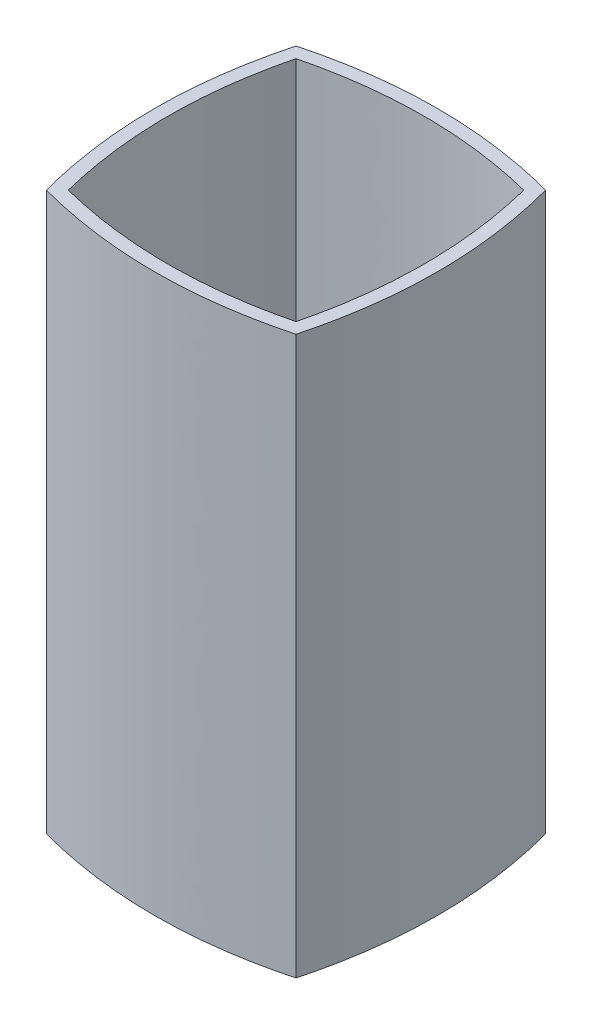
ISO-10303-21;
HEADER;
FILE_DESCRIPTION(('STEP AP214'),'2;1');
FILE_NAME('part.step','',(''),(''),'','','');
FILE_SCHEMA(('AUTOMOTIVE_DESIGN { 1 0 10303 214 1 1 1 1 }'));
ENDSEC;
DATA;
#1=APPLICATION_CONTEXT('core data for automotive mechanical design processes');
#2=APPLICATION_PROTOCOL_DEFINITION('international standard','automotive_design',2000,#1);
#3=PRODUCT_CONTEXT('',#1,'mechanical');
#4=PRODUCT('Part','Part','',(#3));
#5=PRODUCT_RELATED_PRODUCT_CATEGORY('part','',(#4));
#6=PRODUCT_DEFINITION_FORMATION('','',#4);
#7=PRODUCT_DEFINITION_CONTEXT('part definition',#1,'design');
#8=PRODUCT_DEFINITION('design','',#6,#7);
#9=PRODUCT_DEFINITION_SHAPE('','',#8);
#10=(LENGTH_UNIT() NAMED_UNIT(*) SI_UNIT(.MILLI.,.METRE.));
#11=(NAMED_UNIT(*) PLANE_ANGLE_UNIT() SI_UNIT($,.RADIAN.));
#12=(NAMED_UNIT(*) SI_UNIT($,.STERADIAN.) SOLID_ANGLE_UNIT());
#13=UNCERTAINTY_MEASURE_WITH_UNIT(LENGTH_MEASURE(1.E-05),#10,'distance_accuracy_value','');
#14=(GEOMETRIC_REPRESENTATION_CONTEXT(3) GLOBAL_UNCERTAINTY_ASSIGNED_CONTEXT((#13)) GLOBAL_UNIT_ASSIGNED_CONTEXT((#10,
#11,#12)) REPRESENTATION_CONTEXT('',''));
#15=CARTESIAN_POINT('',(0.,0.,0.));
#16=DIRECTION('',(0.,0.,1.));
#17=DIRECTION('',(1.,0.,0.));
#18=AXIS2_PLACEMENT_3D('',#15,#16,#17);
#19=CARTESIAN_POINT('',(-26.9875,106.3625,0.));
#20=DIRECTION('',(0.,-1.,0.));
#21=DIRECTION('',(0.,0.,-1.));
#22=AXIS2_PLACEMENT_3D('',#19,#20,#21);
#23=PLANE('',#22);
#24=CARTESIAN_POINT('',(-23.8125,106.3625,-23.8125));
#25=CARTESIAN_POINT('',(-30.1625,106.3625,0.));
#26=CARTESIAN_POINT('',(-23.8125,106.3625,23.8125));
#27=B_SPLINE_CURVE_WITH_KNOTS('',2,(#24,#25,#26),.UNSPECIFIED.,.F.,.F.,(3,3),(0.,1.),.UNSPECIFIED.);
#28=CARTESIAN_POINT('',(-23.8125,106.3625,-23.8125));
#29=VERTEX_POINT('',#28);
#30=CARTESIAN_POINT('',(-23.8125,106.3625,23.8125));
#31=VERTEX_POINT('',#30);
#32=EDGE_CURVE('E265',#29,#31,#27,.T.);
#33=ORIENTED_EDGE('',*,*,#32,.T.);
#34=CARTESIAN_POINT('',(-23.8125,106.3625,23.8125));
#35=CARTESIAN_POINT('',(0.,106.3625,30.1625));
#36=CARTESIAN_POINT('',(23.8125,106.3625,23.8125));
#37=B_SPLINE_CURVE_WITH_KNOTS('',2,(#34,#35,#36),.UNSPECIFIED.,.F.,.F.,(3,3),(0.,1.),.UNSPECIFIED.);
#38=CARTESIAN_POINT('',(23.8125,106.3625,23.8125));
#39=VERTEX_POINT('',#38);
#40=EDGE_CURVE('E285',#31,#39,#37,.T.);
#41=ORIENTED_EDGE('',*,*,#40,.T.);
#42=CARTESIAN_POINT('',(23.8125,106.3625,-23.8125));
#43=CARTESIAN_POINT('',(30.1625,106.3625,0.));
#44=CARTESIAN_POINT('',(23.8125,106.3625,23.8125));
#45=B_SPLINE_CURVE_WITH_KNOTS('',2,(#42,#43,#44),.UNSPECIFIED.,.F.,.F.,(3,3),(0.,1.),.UNSPECIFIED.);
#46=CARTESIAN_POINT('',(23.8125,106.3625,-23.8125));
#47=VERTEX_POINT('',#46);
#48=EDGE_CURVE('E229',#47,#39,#45,.T.);
#49=ORIENTED_EDGE('',*,*,#48,.F.);
#50=CARTESIAN_POINT('',(-23.8125,106.3625,-23.8125));
#51=CARTESIAN_POINT('',(0.,106.3625,-30.1625));
#52=CARTESIAN_POINT('',(23.8125,106.3625,-23.8125));
#53=B_SPLINE_CURVE_WITH_KNOTS('',2,(#50,#51,#52),.UNSPECIFIED.,.F.,.F.,(3,3),(0.,1.),.UNSPECIFIED.);
#54=EDGE_CURVE('E222',#29,#47,#53,.T.);
#55=ORIENTED_EDGE('',*,*,#54,.F.);
#56=EDGE_LOOP('',(#33,#41,#49,#55));
#57=FACE_BOUND('',#56,.T.);
#58=CARTESIAN_POINT('',(-21.7278824316532,106.3625,-21.7278824316532));
#59=CARTESIAN_POINT('',(-22.6181644407082,106.3625,-18.1699784596124));
#60=CARTESIAN_POINT('',(-23.2995731862004,106.3625,-14.5748367331748));
#61=CARTESIAN_POINT('',(-23.9869531116533,106.3625,-9.12244818399765));
#62=CARTESIAN_POINT('',(-24.1600079505111,106.3625,-7.29530286620825));
#63=CARTESIAN_POINT('',(-24.390253271937,106.3625,-3.64258122880582));
#64=CARTESIAN_POINT('',(-24.44783328894,106.3625,-1.81431538247749));
#65=CARTESIAN_POINT('',(-24.4471638088413,106.3625,1.84605100407184));
#66=CARTESIAN_POINT('',(-24.3886108908414,106.3625,3.68152659891922));
#67=CARTESIAN_POINT('',(-24.1567139061339,106.3625,7.3343929685884));
#68=CARTESIAN_POINT('',(-23.9836306928442,106.3625,9.15253036494701));
#69=CARTESIAN_POINT('',(-23.2976290557148,106.3625,14.5827306689455));
#70=CARTESIAN_POINT('',(-22.6180115727221,106.3625,18.1705893779611));
#71=CARTESIAN_POINT('',(-21.7278824316532,106.3625,21.7278824316532));
#72=B_SPLINE_CURVE_WITH_KNOTS('',3,(#58,#59,#60,#61,#62,#63,#64,#65,#66,#67,#68,#69,#70,#71),
.UNSPECIFIED.,.F.,.F.,(4,2,2,2,2,2,4),(0.,0.25,0.375,0.5,0.625,0.75,1.),.UNSPECIFIED.);
#73=CARTESIAN_POINT('',(-21.7278824316532,106.3625,-21.7278824316532));
#74=VERTEX_POINT('',#73);
#75=CARTESIAN_POINT('',(-21.7278824316532,106.3625,21.7278824316532));
#76=VERTEX_POINT('',#75);
#77=EDGE_CURVE('E165',#74,#76,#72,.T.);
#78=ORIENTED_EDGE('',*,*,#77,.F.);
#79=CARTESIAN_POINT('',(-21.7278824316532,106.3625,-21.7278824316532));
#80=CARTESIAN_POINT('',(-18.1699784596123,106.3625,-22.6181644407082));
#81=CARTESIAN_POINT('',(-14.5748367331748,106.3625,-23.2995731862004));
#82=CARTESIAN_POINT('',(-9.12244818399765,106.3625,-23.9869531116533));
#83=CARTESIAN_POINT('',(-7.29530286620824,106.3625,-24.1600079505111));
#84=CARTESIAN_POINT('',(-3.64258122880581,106.3625,-24.390253271937));
#85=CARTESIAN_POINT('',(-1.81431538247748,106.3625,-24.44783328894));
#86=CARTESIAN_POINT('',(1.84605100407185,106.3625,-24.4471638088413));
#87=CARTESIAN_POINT('',(3.68152659891923,106.3625,-24.3886108908414));
#88=CARTESIAN_POINT('',(7.33439296858842,106.3625,-24.1567139061339));
#89=CARTESIAN_POINT('',(9.152530364947,106.3625,-23.9836306928442));
#90=CARTESIAN_POINT('',(14.5827306689455,106.3625,-23.2976290557148));
#91=CARTESIAN_POINT('',(18.1705893779611,106.3625,-22.6180115727221));
#92=CARTESIAN_POINT('',(21.7278824316532,106.3625,-21.7278824316532));
#93=B_SPLINE_CURVE_WITH_KNOTS('',3,(#79,#80,#81,#82,#83,#84,#85,#86,#87,#88,#89,#90,#91,#92),
.UNSPECIFIED.,.F.,.F.,(4,2,2,2,2,2,4),(0.,0.25,0.375,0.5,0.625,0.75,1.),.UNSPECIFIED.);
#94=CARTESIAN_POINT('',(21.7278824316532,106.3625,-21.7278824316532));
#95=VERTEX_POINT('',#94);
#96=EDGE_CURVE('E185',#74,#95,#93,.T.);
#97=ORIENTED_EDGE('',*,*,#96,.T.);
#98=CARTESIAN_POINT('',(21.7278824316532,106.3625,-21.7278824316532));
#99=CARTESIAN_POINT('',(22.6181644407082,106.3625,-18.1699784596124));
#100=CARTESIAN_POINT('',(23.2995731862004,106.3625,-14.5748367331748));
#101=CARTESIAN_POINT('',(23.9869531116533,106.3625,-9.12244818399765));
#102=CARTESIAN_POINT('',(24.1600079505111,106.3625,-7.29530286620825));
#103=CARTESIAN_POINT('',(24.390253271937,106.3625,-3.64258122880581));
#104=CARTESIAN_POINT('',(24.44783328894,106.3625,-1.81431538247749));
#105=CARTESIAN_POINT('',(24.4471638088413,106.3625,1.84605100407184));
#106=CARTESIAN_POINT('',(24.3886108908414,106.3625,3.68152659891922));
#107=CARTESIAN_POINT('',(24.1567139061339,106.3625,7.33439296858841));
#108=CARTESIAN_POINT('',(23.9836306928442,106.3625,9.15253036494701));
#109=CARTESIAN_POINT('',(23.2976290557148,106.3625,14.5827306689455));
#110=CARTESIAN_POINT('',(22.6180115727222,106.3625,18.1705893779611));
#111=CARTESIAN_POINT('',(21.7278824316532,106.3625,21.7278824316532));
#112=B_SPLINE_CURVE_WITH_KNOTS('',3,(#98,#99,#100,#101,#102,#103,#104,#105,#106,#107,#108,#109,
#110,#111),.UNSPECIFIED.,.F.,.F.,(4,2,2,2,2,2,4),(0.,0.25,0.375,0.5,0.625,0.75,1.),.UNSPECIFIED.);
#113=CARTESIAN_POINT('',(21.7278824316532,106.3625,21.7278824316532));
#114=VERTEX_POINT('',#113);
#115=EDGE_CURVE('E115',#95,#114,#112,.T.);
#116=ORIENTED_EDGE('',*,*,#115,.T.);
#117=CARTESIAN_POINT('',(-21.7278824316532,106.3625,21.7278824316532));
#118=CARTESIAN_POINT('',(-18.1699784596124,106.3625,22.6181644407082));
#119=CARTESIAN_POINT('',(-14.5748367331748,106.3625,23.2995731862004));
#120=CARTESIAN_POINT('',(-9.12244818399764,106.3625,23.9869531116533));
#121=CARTESIAN_POINT('',(-7.29530286620825,106.3625,24.1600079505111));
#122=CARTESIAN_POINT('',(-3.64258122880581,106.3625,24.390253271937));
#123=CARTESIAN_POINT('',(-1.81431538247748,106.3625,24.44783328894));
#124=CARTESIAN_POINT('',(1.84605100407186,106.3625,24.4471638088413));
#125=CARTESIAN_POINT('',(3.68152659891924,106.3625,24.3886108908414));
#126=CARTESIAN_POINT('',(7.33439296858843,106.3625,24.1567139061339));
#127=CARTESIAN_POINT('',(9.15253036494701,106.3625,23.9836306928442));
#128=CARTESIAN_POINT('',(14.5827306689455,106.3625,23.2976290557148));
#129=CARTESIAN_POINT('',(18.1705893779611,106.3625,22.6180115727221));
#130=CARTESIAN_POINT('',(21.7278824316532,106.3625,21.7278824316532));
#131=B_SPLINE_CURVE_WITH_KNOTS('',3,(#117,#118,#119,#120,#121,#122,#123,#124,#125,#126,#127,
#128,#129,#130),.UNSPECIFIED.,.F.,.F.,(4,2,2,2,2,2,4),(0.,0.25,0.375,0.5,0.625,0.75,1.),.UNSPECIFIED.);
#132=EDGE_CURVE('E174',#76,#114,#131,.T.);
#133=ORIENTED_EDGE('',*,*,#132,.F.);
#134=EDGE_LOOP('',(#78,#97,#116,#133));
#135=FACE_BOUND('',#134,.T.);
#136=ADVANCED_FACE('F99',(#57,#135),#23,.F.);
#137=CARTESIAN_POINT('',(-26.9875,0.,0.));
#138=DIRECTION('',(0.,-1.,0.));
#139=DIRECTION('',(0.,0.,-1.));
#140=AXIS2_PLACEMENT_3D('',#137,#138,#139);
#141=PLANE('',#140);
#142=CARTESIAN_POINT('',(-23.8125,0.,-23.8125));
#143=CARTESIAN_POINT('',(-30.1625,0.,0.));
#144=CARTESIAN_POINT('',(-23.8125,0.,23.8125));
#145=B_SPLINE_CURVE_WITH_KNOTS('',2,(#142,#143,#144),.UNSPECIFIED.,.F.,.F.,(3,3),(0.,1.),.UNSPECIFIED.);
#146=CARTESIAN_POINT('',(-23.8125,0.,-23.8125));
#147=VERTEX_POINT('',#146);
#148=CARTESIAN_POINT('',(-23.8125,0.,23.8125));
#149=VERTEX_POINT('',#148);
#150=EDGE_CURVE('E181',#147,#149,#145,.T.);
#151=ORIENTED_EDGE('',*,*,#150,.F.);
#152=CARTESIAN_POINT('',(-23.8125,0.,-23.8125));
#153=CARTESIAN_POINT('',(0.,0.,-30.1625));
#154=CARTESIAN_POINT('',(23.8125,0.,-23.8125));
#155=B_SPLINE_CURVE_WITH_KNOTS('',2,(#152,#153,#154),.UNSPECIFIED.,.F.,.F.,(3,3),(0.,1.),.UNSPECIFIED.);
#156=CARTESIAN_POINT('',(23.8125,0.,-23.8125));
#157=VERTEX_POINT('',#156);
#158=EDGE_CURVE('E257',#147,#157,#155,.T.);
#159=ORIENTED_EDGE('',*,*,#158,.T.);
#160=CARTESIAN_POINT('',(23.8125,0.,-23.8125));
#161=CARTESIAN_POINT('',(30.1625,0.,0.));
#162=CARTESIAN_POINT('',(23.8125,0.,23.8125));
#163=B_SPLINE_CURVE_WITH_KNOTS('',2,(#160,#161,#162),.UNSPECIFIED.,.F.,.F.,(3,3),(0.,1.),.UNSPECIFIED.);
#164=CARTESIAN_POINT('',(23.8125,0.,23.8125));
#165=VERTEX_POINT('',#164);
#166=EDGE_CURVE('E249',#157,#165,#163,.T.);
#167=ORIENTED_EDGE('',*,*,#166,.T.);
#168=CARTESIAN_POINT('',(-23.8125,0.,23.8125));
#169=CARTESIAN_POINT('',(0.,0.,30.1625));
#170=CARTESIAN_POINT('',(23.8125,0.,23.8125));
#171=B_SPLINE_CURVE_WITH_KNOTS('',2,(#168,#169,#170),.UNSPECIFIED.,.F.,.F.,(3,3),(0.,1.),.UNSPECIFIED.);
#172=EDGE_CURVE('E241',#149,#165,#171,.T.);
#173=ORIENTED_EDGE('',*,*,#172,.F.);
#174=EDGE_LOOP('',(#151,#159,#167,#173));
#175=FACE_BOUND('',#174,.T.);
#176=CARTESIAN_POINT('',(-21.7278824316532,0.,-21.7278824316532));
#177=CARTESIAN_POINT('',(-18.1699784596123,0.,-22.6181644407082));
#178=CARTESIAN_POINT('',(-14.5748367331748,0.,-23.2995731862004));
#179=CARTESIAN_POINT('',(-9.12244818399765,0.,-23.9869531116533));
#180=CARTESIAN_POINT('',(-7.29530286620824,0.,-24.1600079505111));
#181=CARTESIAN_POINT('',(-3.64258122880581,0.,-24.390253271937));
#182=CARTESIAN_POINT('',(-1.81431538247748,0.,-24.44783328894));
#183=CARTESIAN_POINT('',(1.84605100407185,0.,-24.4471638088413));
#184=CARTESIAN_POINT('',(3.68152659891923,0.,-24.3886108908414));
#185=CARTESIAN_POINT('',(7.33439296858842,0.,-24.1567139061339));
#186=CARTESIAN_POINT('',(9.152530364947,0.,-23.9836306928442));
#187=CARTESIAN_POINT('',(14.5827306689455,0.,-23.2976290557148));
#188=CARTESIAN_POINT('',(18.1705893779611,0.,-22.6180115727221));
#189=CARTESIAN_POINT('',(21.7278824316532,0.,-21.7278824316532));
#190=B_SPLINE_CURVE_WITH_KNOTS('',3,(#176,#177,#178,#179,#180,#181,#182,#183,#184,#185,#186,
#187,#188,#189),.UNSPECIFIED.,.F.,.F.,(4,2,2,2,2,2,4),(0.,0.25,0.375,0.5,0.625,0.75,1.),.UNSPECIFIED.);
#191=CARTESIAN_POINT('',(-21.7278824316532,0.,-21.7278824316532));
#192=VERTEX_POINT('',#191);
#193=CARTESIAN_POINT('',(21.7278824316532,0.,-21.7278824316532));
#194=VERTEX_POINT('',#193);
#195=EDGE_CURVE('E175',#192,#194,#190,.T.);
#196=ORIENTED_EDGE('',*,*,#195,.F.);
#197=CARTESIAN_POINT('',(-21.7278824316532,0.,-21.7278824316532));
#198=CARTESIAN_POINT('',(-22.6181644407082,0.,-18.1699784596124));
#199=CARTESIAN_POINT('',(-23.2995731862004,0.,-14.5748367331748));
#200=CARTESIAN_POINT('',(-23.9869531116533,0.,-9.12244818399765));
#201=CARTESIAN_POINT('',(-24.1600079505111,0.,-7.29530286620825));
#202=CARTESIAN_POINT('',(-24.390253271937,0.,-3.64258122880582));
#203=CARTESIAN_POINT('',(-24.44783328894,0.,-1.81431538247749));
#204=CARTESIAN_POINT('',(-24.4471638088413,0.,1.84605100407184));
#205=CARTESIAN_POINT('',(-24.3886108908414,0.,3.68152659891922));
#206=CARTESIAN_POINT('',(-24.1567139061339,0.,7.3343929685884));
#207=CARTESIAN_POINT('',(-23.9836306928442,0.,9.15253036494701));
#208=CARTESIAN_POINT('',(-23.2976290557148,0.,14.5827306689455));
#209=CARTESIAN_POINT('',(-22.6180115727221,0.,18.1705893779611));
#210=CARTESIAN_POINT('',(-21.7278824316532,0.,21.7278824316532));
#211=B_SPLINE_CURVE_WITH_KNOTS('',3,(#197,#198,#199,#200,#201,#202,#203,#204,#205,#206,#207,
#208,#209,#210),.UNSPECIFIED.,.F.,.F.,(4,2,2,2,2,2,4),(0.,0.25,0.375,0.5,0.625,0.75,1.),.UNSPECIFIED.);
#212=CARTESIAN_POINT('',(-21.7278824316532,0.,21.7278824316532));
#213=VERTEX_POINT('',#212);
#214=EDGE_CURVE('E123',#192,#213,#211,.T.);
#215=ORIENTED_EDGE('',*,*,#214,.T.);
#216=CARTESIAN_POINT('',(-21.7278824316532,0.,21.7278824316532));
#217=CARTESIAN_POINT('',(-18.1699784596124,0.,22.6181644407082));
#218=CARTESIAN_POINT('',(-14.5748367331748,0.,23.2995731862004));
#219=CARTESIAN_POINT('',(-9.12244818399764,0.,23.9869531116533));
#220=CARTESIAN_POINT('',(-7.29530286620825,0.,24.1600079505111));
#221=CARTESIAN_POINT('',(-3.64258122880581,0.,24.390253271937));
#222=CARTESIAN_POINT('',(-1.81431538247748,0.,24.44783328894));
#223=CARTESIAN_POINT('',(1.84605100407186,0.,24.4471638088413));
#224=CARTESIAN_POINT('',(3.68152659891924,0.,24.3886108908414));
#225=CARTESIAN_POINT('',(7.33439296858843,0.,24.1567139061339));
#226=CARTESIAN_POINT('',(9.15253036494701,0.,23.9836306928442));
#227=CARTESIAN_POINT('',(14.5827306689455,0.,23.2976290557148));
#228=CARTESIAN_POINT('',(18.1705893779611,0.,22.6180115727221));
#229=CARTESIAN_POINT('',(21.7278824316532,0.,21.7278824316532));
#230=B_SPLINE_CURVE_WITH_KNOTS('',3,(#216,#217,#218,#219,#220,#221,#222,#223,#224,#225,#226,
#227,#228,#229),.UNSPECIFIED.,.F.,.F.,(4,2,2,2,2,2,4),(0.,0.25,0.375,0.5,0.625,0.75,1.),.UNSPECIFIED.);
#231=CARTESIAN_POINT('',(21.7278824316532,0.,21.7278824316532));
#232=VERTEX_POINT('',#231);
#233=EDGE_CURVE('E180',#213,#232,#230,.T.);
#234=ORIENTED_EDGE('',*,*,#233,.T.);
#235=CARTESIAN_POINT('',(21.7278824316532,0.,-21.7278824316532));
#236=CARTESIAN_POINT('',(22.6181644407082,0.,-18.1699784596124));
#237=CARTESIAN_POINT('',(23.2995731862004,0.,-14.5748367331748));
#238=CARTESIAN_POINT('',(23.9869531116533,0.,-9.12244818399765));
#239=CARTESIAN_POINT('',(24.1600079505111,0.,-7.29530286620825));
#240=CARTESIAN_POINT('',(24.390253271937,0.,-3.64258122880581));
#241=CARTESIAN_POINT('',(24.44783328894,0.,-1.81431538247749));
#242=CARTESIAN_POINT('',(24.4471638088413,0.,1.84605100407184));
#243=CARTESIAN_POINT('',(24.3886108908414,0.,3.68152659891922));
#244=CARTESIAN_POINT('',(24.1567139061339,0.,7.33439296858841));
#245=CARTESIAN_POINT('',(23.9836306928442,0.,9.15253036494701));
#246=CARTESIAN_POINT('',(23.2976290557148,0.,14.5827306689455));
#247=CARTESIAN_POINT('',(22.6180115727222,0.,18.1705893779611));
#248=CARTESIAN_POINT('',(21.7278824316532,0.,21.7278824316532));
#249=B_SPLINE_CURVE_WITH_KNOTS('',3,(#235,#236,#237,#238,#239,#240,#241,#242,#243,#244,#245,
#246,#247,#248),.UNSPECIFIED.,.F.,.F.,(4,2,2,2,2,2,4),(0.,0.25,0.375,0.5,0.625,0.75,1.),.UNSPECIFIED.);
#250=EDGE_CURVE('E380',#194,#232,#249,.T.);
#251=ORIENTED_EDGE('',*,*,#250,.F.);
#252=EDGE_LOOP('',(#196,#215,#234,#251));
#253=FACE_BOUND('',#252,.T.);
#254=ADVANCED_FACE('F211',(#175,#253),#141,.T.);
#255=DIRECTION('',(0.,-1.,0.));
#256=VECTOR('',#255,1.);
#257=SURFACE_OF_LINEAR_EXTRUSION('',#27,#256);
#258=ORIENTED_EDGE('',*,*,#150,.T.);
#259=DIRECTION('',(0.,-1.,0.));
#260=VECTOR('',#259,1.);
#261=CARTESIAN_POINT('',(-23.8125,106.3625,23.8125));
#262=LINE('',#261,#260);
#263=EDGE_CURVE('E12',#31,#149,#262,.T.);
#264=ORIENTED_EDGE('',*,*,#263,.F.);
#265=ORIENTED_EDGE('',*,*,#32,.F.);
#266=DIRECTION('',(0.,-1.,0.));
#267=VECTOR('',#266,1.);
#268=CARTESIAN_POINT('',(-23.8125,106.3625,-23.8125));
#269=LINE('',#268,#267);
#270=EDGE_CURVE('E228',#29,#147,#269,.T.);
#271=ORIENTED_EDGE('',*,*,#270,.T.);
#272=EDGE_LOOP('',(#258,#264,#265,#271));
#273=FACE_BOUND('',#272,.T.);
#274=ADVANCED_FACE('F101',(#273),#257,.F.);
#275=DIRECTION('',(0.,-1.,0.));
#276=VECTOR('',#275,1.);
#277=SURFACE_OF_LINEAR_EXTRUSION('',#37,#276);
#278=ORIENTED_EDGE('',*,*,#172,.T.);
#279=DIRECTION('',(0.,-1.,0.));
#280=VECTOR('',#279,1.);
#281=CARTESIAN_POINT('',(23.8125,106.3625,23.8125));
#282=LINE('',#281,#280);
#283=EDGE_CURVE('E108',#39,#165,#282,.T.);
#284=ORIENTED_EDGE('',*,*,#283,.F.);
#285=ORIENTED_EDGE('',*,*,#40,.F.);
#286=ORIENTED_EDGE('',*,*,#263,.T.);
#287=EDGE_LOOP('',(#278,#284,#285,#286));
#288=FACE_BOUND('',#287,.T.);
#289=ADVANCED_FACE('F277',(#288),#277,.F.);
#290=DIRECTION('',(0.,-1.,0.));
#291=VECTOR('',#290,1.);
#292=SURFACE_OF_LINEAR_EXTRUSION('',#45,#291);
#293=ORIENTED_EDGE('',*,*,#166,.F.);
#294=DIRECTION('',(0.,-1.,0.));
#295=VECTOR('',#294,1.);
#296=CARTESIAN_POINT('',(23.8125,106.3625,-23.8125));
#297=LINE('',#296,#295);
#298=EDGE_CURVE('E270',#47,#157,#297,.T.);
#299=ORIENTED_EDGE('',*,*,#298,.F.);
#300=ORIENTED_EDGE('',*,*,#48,.T.);
#301=ORIENTED_EDGE('',*,*,#283,.T.);
#302=EDGE_LOOP('',(#293,#299,#300,#301));
#303=FACE_BOUND('',#302,.T.);
#304=ADVANCED_FACE('F219',(#303),#292,.T.);
#305=DIRECTION('',(0.,-1.,0.));
#306=VECTOR('',#305,1.);
#307=SURFACE_OF_LINEAR_EXTRUSION('',#53,#306);
#308=ORIENTED_EDGE('',*,*,#158,.F.);
#309=ORIENTED_EDGE('',*,*,#270,.F.);
#310=ORIENTED_EDGE('',*,*,#54,.T.);
#311=ORIENTED_EDGE('',*,*,#298,.T.);
#312=EDGE_LOOP('',(#308,#309,#310,#311));
#313=FACE_BOUND('',#312,.T.);
#314=ADVANCED_FACE('F208',(#313),#307,.T.);
#315=DIRECTION('',(0.,-1.,0.));
#316=VECTOR('',#315,1.);
#317=SURFACE_OF_LINEAR_EXTRUSION('',#72,#316);
#318=ORIENTED_EDGE('',*,*,#214,.F.);
#319=DIRECTION('',(0.,-1.,0.));
#320=VECTOR('',#319,1.);
#321=CARTESIAN_POINT('',(-21.7278824316532,106.3625,-21.7278824316532));
#322=LINE('',#321,#320);
#323=EDGE_CURVE('E169',#74,#192,#322,.T.);
#324=ORIENTED_EDGE('',*,*,#323,.F.);
#325=ORIENTED_EDGE('',*,*,#77,.T.);
#326=DIRECTION('',(0.,-1.,0.));
#327=VECTOR('',#326,1.);
#328=CARTESIAN_POINT('',(-21.7278824316532,106.3625,21.7278824316532));
#329=LINE('',#328,#327);
#330=EDGE_CURVE('E168',#76,#213,#329,.T.);
#331=ORIENTED_EDGE('',*,*,#330,.T.);
#332=EDGE_LOOP('',(#318,#324,#325,#331));
#333=FACE_BOUND('',#332,.T.);
#334=ADVANCED_FACE('F167',(#333),#317,.T.);
#335=DIRECTION('',(0.,-1.,0.));
#336=VECTOR('',#335,1.);
#337=SURFACE_OF_LINEAR_EXTRUSION('',#131,#336);
#338=ORIENTED_EDGE('',*,*,#233,.F.);
#339=ORIENTED_EDGE('',*,*,#330,.F.);
#340=ORIENTED_EDGE('',*,*,#132,.T.);
#341=DIRECTION('',(0.,-1.,0.));
#342=VECTOR('',#341,1.);
#343=CARTESIAN_POINT('',(21.7278824316532,106.3625,21.7278824316532));
#344=LINE('',#343,#342);
#345=EDGE_CURVE('E182',#114,#232,#344,.T.);
#346=ORIENTED_EDGE('',*,*,#345,.T.);
#347=EDGE_LOOP('',(#338,#339,#340,#346));
#348=FACE_BOUND('',#347,.T.);
#349=ADVANCED_FACE('F178',(#348),#337,.T.);
#350=DIRECTION('',(0.,-1.,0.));
#351=VECTOR('',#350,1.);
#352=SURFACE_OF_LINEAR_EXTRUSION('',#112,#351);
#353=ORIENTED_EDGE('',*,*,#250,.T.);
#354=ORIENTED_EDGE('',*,*,#345,.F.);
#355=ORIENTED_EDGE('',*,*,#115,.F.);
#356=DIRECTION('',(0.,-1.,0.));
#357=VECTOR('',#356,1.);
#358=CARTESIAN_POINT('',(21.7278824316532,106.3625,-21.7278824316532));
#359=LINE('',#358,#357);
#360=EDGE_CURVE('E398',#95,#194,#359,.T.);
#361=ORIENTED_EDGE('',*,*,#360,.T.);
#362=EDGE_LOOP('',(#353,#354,#355,#361));
#363=FACE_BOUND('',#362,.T.);
#364=ADVANCED_FACE('F204',(#363),#352,.F.);
#365=DIRECTION('',(0.,-1.,0.));
#366=VECTOR('',#365,1.);
#367=SURFACE_OF_LINEAR_EXTRUSION('',#93,#366);
#368=ORIENTED_EDGE('',*,*,#195,.T.);
#369=ORIENTED_EDGE('',*,*,#360,.F.);
#370=ORIENTED_EDGE('',*,*,#96,.F.);
#371=ORIENTED_EDGE('',*,*,#323,.T.);
#372=EDGE_LOOP('',(#368,#369,#370,#371));
#373=FACE_BOUND('',#372,.T.);
#374=ADVANCED_FACE('F349',(#373),#367,.F.);
#375=CLOSED_SHELL('',(#136,#254,#274,#289,#304,#314,#334,#349,#364,#374));
#376=MANIFOLD_SOLID_BREP('B2',#375);
#377=ADVANCED_BREP_SHAPE_REPRESENTATION('',(#18,#376),#14);
#378=SHAPE_DEFINITION_REPRESENTATION(#9,#377);
ENDSEC;
END-ISO-10303-21;
